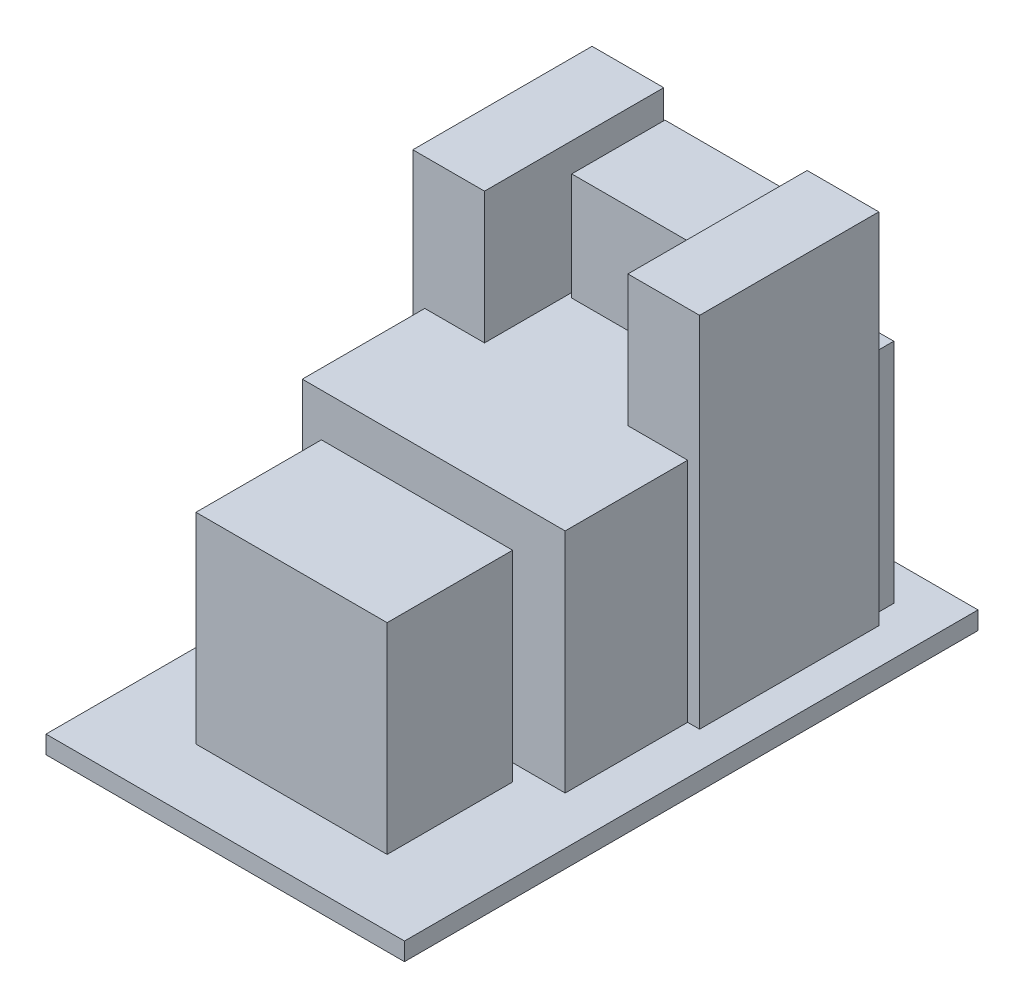
ISO-10303-21;
HEADER;
FILE_DESCRIPTION(('STEP AP214'),'2;1');
FILE_NAME('part.step','',(''),(''),'','','');
FILE_SCHEMA(('AUTOMOTIVE_DESIGN { 1 0 10303 214 1 1 1 1 }'));
ENDSEC;
DATA;
#1=APPLICATION_CONTEXT('core data for automotive mechanical design processes');
#2=APPLICATION_PROTOCOL_DEFINITION('international standard','automotive_design',2000,#1);
#3=PRODUCT_CONTEXT('',#1,'mechanical');
#4=PRODUCT('Part','Part','',(#3));
#5=PRODUCT_RELATED_PRODUCT_CATEGORY('part','',(#4));
#6=PRODUCT_DEFINITION_FORMATION('','',#4);
#7=PRODUCT_DEFINITION_CONTEXT('part definition',#1,'design');
#8=PRODUCT_DEFINITION('design','',#6,#7);
#9=PRODUCT_DEFINITION_SHAPE('','',#8);
#10=(LENGTH_UNIT() NAMED_UNIT(*) SI_UNIT(.MILLI.,.METRE.));
#11=(NAMED_UNIT(*) PLANE_ANGLE_UNIT() SI_UNIT($,.RADIAN.));
#12=(NAMED_UNIT(*) SI_UNIT($,.STERADIAN.) SOLID_ANGLE_UNIT());
#13=UNCERTAINTY_MEASURE_WITH_UNIT(LENGTH_MEASURE(1.E-05),#10,'distance_accuracy_value','');
#14=(GEOMETRIC_REPRESENTATION_CONTEXT(3) GLOBAL_UNCERTAINTY_ASSIGNED_CONTEXT((#13)) GLOBAL_UNIT_ASSIGNED_CONTEXT((#10,
#11,#12)) REPRESENTATION_CONTEXT('',''));
#15=CARTESIAN_POINT('',(0.,0.,0.));
#16=DIRECTION('',(0.,0.,1.));
#17=DIRECTION('',(1.,0.,0.));
#18=AXIS2_PLACEMENT_3D('',#15,#16,#17);
#19=CARTESIAN_POINT('',(0.,190.,0.));
#20=DIRECTION('',(0.,-1.,0.));
#21=DIRECTION('',(0.,0.,-1.));
#22=AXIS2_PLACEMENT_3D('',#19,#20,#21);
#23=PLANE('',#22);
#24=DIRECTION('',(-1.,0.,0.));
#25=VECTOR('',#24,1.);
#26=CARTESIAN_POINT('',(0.,190.,-187.));
#27=LINE('',#26,#25);
#28=CARTESIAN_POINT('',(110.,190.,-187.));
#29=VERTEX_POINT('',#28);
#30=CARTESIAN_POINT('',(60.,190.,-187.));
#31=VERTEX_POINT('',#30);
#32=EDGE_CURVE('E281',#29,#31,#27,.T.);
#33=ORIENTED_EDGE('',*,*,#32,.F.);
#34=DIRECTION('',(0.,0.,-1.));
#35=VECTOR('',#34,1.);
#36=CARTESIAN_POINT('',(110.,190.,65.5));
#37=LINE('',#36,#35);
#38=CARTESIAN_POINT('',(110.,190.,-209.5));
#39=VERTEX_POINT('',#38);
#40=EDGE_CURVE('E358',#29,#39,#37,.T.);
#41=ORIENTED_EDGE('',*,*,#40,.T.);
#42=DIRECTION('',(-1.,0.,0.));
#43=VECTOR('',#42,1.);
#44=CARTESIAN_POINT('',(-110.,190.,-209.5));
#45=LINE('',#44,#43);
#46=CARTESIAN_POINT('',(-110.,190.,-209.5));
#47=VERTEX_POINT('',#46);
#48=EDGE_CURVE('E357',#39,#47,#45,.T.);
#49=ORIENTED_EDGE('',*,*,#48,.T.);
#50=DIRECTION('',(0.,0.,1.));
#51=VECTOR('',#50,1.);
#52=CARTESIAN_POINT('',(-110.,190.,65.5));
#53=LINE('',#52,#51);
#54=CARTESIAN_POINT('',(-110.,190.,-187.));
#55=VERTEX_POINT('',#54);
#56=EDGE_CURVE('E361',#47,#55,#53,.T.);
#57=ORIENTED_EDGE('',*,*,#56,.T.);
#58=DIRECTION('',(-1.,0.,0.));
#59=VECTOR('',#58,1.);
#60=CARTESIAN_POINT('',(0.,190.,-187.));
#61=LINE('',#60,#59);
#62=CARTESIAN_POINT('',(-60.,190.,-187.));
#63=VERTEX_POINT('',#62);
#64=EDGE_CURVE('E428',#63,#55,#61,.T.);
#65=ORIENTED_EDGE('',*,*,#64,.F.);
#66=DIRECTION('',(0.,0.,-1.));
#67=VECTOR('',#66,1.);
#68=CARTESIAN_POINT('',(-60.,190.,0.));
#69=LINE('',#68,#67);
#70=CARTESIAN_POINT('',(-60.,190.,-37.));
#71=VERTEX_POINT('',#70);
#72=EDGE_CURVE('E425',#71,#63,#69,.T.);
#73=ORIENTED_EDGE('',*,*,#72,.F.);
#74=DIRECTION('',(1.,0.,0.));
#75=VECTOR('',#74,1.);
#76=CARTESIAN_POINT('',(0.,190.,-37.));
#77=LINE('',#76,#75);
#78=CARTESIAN_POINT('',(-110.,190.,-37.));
#79=VERTEX_POINT('',#78);
#80=EDGE_CURVE('E417',#79,#71,#77,.T.);
#81=ORIENTED_EDGE('',*,*,#80,.F.);
#82=CARTESIAN_POINT('',(-110.,190.,65.5));
#83=VERTEX_POINT('',#82);
#84=EDGE_CURVE('E360',#79,#83,#53,.T.);
#85=ORIENTED_EDGE('',*,*,#84,.T.);
#86=DIRECTION('',(1.,0.,0.));
#87=VECTOR('',#86,1.);
#88=CARTESIAN_POINT('',(-110.,190.,65.5));
#89=LINE('',#88,#87);
#90=CARTESIAN_POINT('',(110.,190.,65.5));
#91=VERTEX_POINT('',#90);
#92=EDGE_CURVE('E364',#83,#91,#89,.T.);
#93=ORIENTED_EDGE('',*,*,#92,.T.);
#94=CARTESIAN_POINT('',(110.,190.,-37.));
#95=VERTEX_POINT('',#94);
#96=EDGE_CURVE('E354',#91,#95,#37,.T.);
#97=ORIENTED_EDGE('',*,*,#96,.T.);
#98=DIRECTION('',(1.,0.,0.));
#99=VECTOR('',#98,1.);
#100=CARTESIAN_POINT('',(0.,190.,-37.));
#101=LINE('',#100,#99);
#102=CARTESIAN_POINT('',(60.,190.,-37.));
#103=VERTEX_POINT('',#102);
#104=EDGE_CURVE('E278',#103,#95,#101,.T.);
#105=ORIENTED_EDGE('',*,*,#104,.F.);
#106=DIRECTION('',(0.,0.,1.));
#107=VECTOR('',#106,1.);
#108=CARTESIAN_POINT('',(60.,190.,0.));
#109=LINE('',#108,#107);
#110=EDGE_CURVE('E437',#31,#103,#109,.T.);
#111=ORIENTED_EDGE('',*,*,#110,.F.);
#112=EDGE_LOOP('',(#33,#41,#49,#57,#65,#73,#81,#85,#93,#97,#105,#111));
#113=FACE_BOUND('',#112,.T.);
#114=DIRECTION('',(0.,0.,-1.));
#115=VECTOR('',#114,1.);
#116=CARTESIAN_POINT('',(56.,190.,0.));
#117=LINE('',#116,#115);
#118=CARTESIAN_POINT('',(56.,190.,-106.));
#119=VERTEX_POINT('',#118);
#120=CARTESIAN_POINT('',(56.,190.,-184.));
#121=VERTEX_POINT('',#120);
#122=EDGE_CURVE('E11',#119,#121,#117,.T.);
#123=ORIENTED_EDGE('',*,*,#122,.F.);
#124=DIRECTION('',(1.,0.,0.));
#125=VECTOR('',#124,1.);
#126=CARTESIAN_POINT('',(0.,190.,-106.));
#127=LINE('',#126,#125);
#128=CARTESIAN_POINT('',(-56.,190.,-106.));
#129=VERTEX_POINT('',#128);
#130=EDGE_CURVE('E440',#129,#119,#127,.T.);
#131=ORIENTED_EDGE('',*,*,#130,.F.);
#132=DIRECTION('',(0.,0.,1.));
#133=VECTOR('',#132,1.);
#134=CARTESIAN_POINT('',(-56.,190.,0.));
#135=LINE('',#134,#133);
#136=CARTESIAN_POINT('',(-56.,190.,-184.));
#137=VERTEX_POINT('',#136);
#138=EDGE_CURVE('E59',#137,#129,#135,.T.);
#139=ORIENTED_EDGE('',*,*,#138,.F.);
#140=DIRECTION('',(-1.,0.,0.));
#141=VECTOR('',#140,1.);
#142=CARTESIAN_POINT('',(0.,190.,-184.));
#143=LINE('',#142,#141);
#144=EDGE_CURVE('E49',#121,#137,#143,.T.);
#145=ORIENTED_EDGE('',*,*,#144,.F.);
#146=EDGE_LOOP('',(#123,#131,#139,#145));
#147=FACE_BOUND('',#146,.T.);
#148=ADVANCED_FACE('F41',(#113,#147),#23,.F.);
#149=CARTESIAN_POINT('',(0.,0.,0.));
#150=DIRECTION('',(0.,-1.,0.));
#151=DIRECTION('',(0.,0.,-1.));
#152=AXIS2_PLACEMENT_3D('',#149,#150,#151);
#153=PLANE('',#152);
#154=DIRECTION('',(0.,0.,-1.));
#155=VECTOR('',#154,1.);
#156=CARTESIAN_POINT('',(150.,0.,240.));
#157=LINE('',#156,#155);
#158=CARTESIAN_POINT('',(150.,0.,240.));
#159=VERTEX_POINT('',#158);
#160=CARTESIAN_POINT('',(150.,0.,-240.));
#161=VERTEX_POINT('',#160);
#162=EDGE_CURVE('E390',#159,#161,#157,.T.);
#163=ORIENTED_EDGE('',*,*,#162,.T.);
#164=DIRECTION('',(-1.,0.,0.));
#165=VECTOR('',#164,1.);
#166=CARTESIAN_POINT('',(-150.,0.,-240.));
#167=LINE('',#166,#165);
#168=CARTESIAN_POINT('',(-150.,0.,-240.));
#169=VERTEX_POINT('',#168);
#170=EDGE_CURVE('E407',#161,#169,#167,.T.);
#171=ORIENTED_EDGE('',*,*,#170,.T.);
#172=DIRECTION('',(0.,0.,1.));
#173=VECTOR('',#172,1.);
#174=CARTESIAN_POINT('',(-150.,0.,240.));
#175=LINE('',#174,#173);
#176=CARTESIAN_POINT('',(-150.,0.,240.));
#177=VERTEX_POINT('',#176);
#178=EDGE_CURVE('E410',#169,#177,#175,.T.);
#179=ORIENTED_EDGE('',*,*,#178,.T.);
#180=DIRECTION('',(1.,0.,0.));
#181=VECTOR('',#180,1.);
#182=CARTESIAN_POINT('',(-150.,0.,240.));
#183=LINE('',#182,#181);
#184=EDGE_CURVE('E395',#177,#159,#183,.T.);
#185=ORIENTED_EDGE('',*,*,#184,.T.);
#186=EDGE_LOOP('',(#163,#171,#179,#185));
#187=FACE_BOUND('',#186,.T.);
#188=DIRECTION('',(0.,0.,-1.));
#189=VECTOR('',#188,1.);
#190=CARTESIAN_POINT('',(80.,0.,184.5));
#191=LINE('',#190,#189);
#192=CARTESIAN_POINT('',(80.,0.,184.5));
#193=VERTEX_POINT('',#192);
#194=CARTESIAN_POINT('',(80.,0.,79.5));
#195=VERTEX_POINT('',#194);
#196=EDGE_CURVE('E320',#193,#195,#191,.T.);
#197=ORIENTED_EDGE('',*,*,#196,.F.);
#198=DIRECTION('',(1.,0.,0.));
#199=VECTOR('',#198,1.);
#200=CARTESIAN_POINT('',(-80.,0.,184.5));
#201=LINE('',#200,#199);
#202=CARTESIAN_POINT('',(-80.,0.,184.5));
#203=VERTEX_POINT('',#202);
#204=EDGE_CURVE('E325',#203,#193,#201,.T.);
#205=ORIENTED_EDGE('',*,*,#204,.F.);
#206=DIRECTION('',(0.,0.,1.));
#207=VECTOR('',#206,1.);
#208=CARTESIAN_POINT('',(-80.,0.,184.5));
#209=LINE('',#208,#207);
#210=CARTESIAN_POINT('',(-80.,0.,79.5));
#211=VERTEX_POINT('',#210);
#212=EDGE_CURVE('E337',#211,#203,#209,.T.);
#213=ORIENTED_EDGE('',*,*,#212,.F.);
#214=DIRECTION('',(-1.,0.,0.));
#215=VECTOR('',#214,1.);
#216=CARTESIAN_POINT('',(-80.,0.,79.5));
#217=LINE('',#216,#215);
#218=EDGE_CURVE('E334',#195,#211,#217,.T.);
#219=ORIENTED_EDGE('',*,*,#218,.F.);
#220=EDGE_LOOP('',(#197,#205,#213,#219));
#221=FACE_BOUND('',#220,.T.);
#222=DIRECTION('',(-1.,0.,0.));
#223=VECTOR('',#222,1.);
#224=CARTESIAN_POINT('',(60.,0.,-187.));
#225=LINE('',#224,#223);
#226=CARTESIAN_POINT('',(120.,0.,-187.));
#227=VERTEX_POINT('',#226);
#228=CARTESIAN_POINT('',(110.,0.,-187.));
#229=VERTEX_POINT('',#228);
#230=EDGE_CURVE('E246',#227,#229,#225,.T.);
#231=ORIENTED_EDGE('',*,*,#230,.F.);
#232=DIRECTION('',(0.,0.,-1.));
#233=VECTOR('',#232,1.);
#234=CARTESIAN_POINT('',(120.,0.,-37.));
#235=LINE('',#234,#233);
#236=CARTESIAN_POINT('',(120.,0.,-37.));
#237=VERTEX_POINT('',#236);
#238=EDGE_CURVE('E243',#237,#227,#235,.T.);
#239=ORIENTED_EDGE('',*,*,#238,.F.);
#240=DIRECTION('',(1.,0.,0.));
#241=VECTOR('',#240,1.);
#242=CARTESIAN_POINT('',(60.,0.,-37.));
#243=LINE('',#242,#241);
#244=CARTESIAN_POINT('',(110.,0.,-37.));
#245=VERTEX_POINT('',#244);
#246=EDGE_CURVE('E256',#245,#237,#243,.T.);
#247=ORIENTED_EDGE('',*,*,#246,.F.);
#248=DIRECTION('',(0.,0.,-1.));
#249=VECTOR('',#248,1.);
#250=CARTESIAN_POINT('',(110.,0.,65.5));
#251=LINE('',#250,#249);
#252=CARTESIAN_POINT('',(110.,0.,65.5));
#253=VERTEX_POINT('',#252);
#254=EDGE_CURVE('E367',#253,#245,#251,.T.);
#255=ORIENTED_EDGE('',*,*,#254,.F.);
#256=DIRECTION('',(1.,0.,0.));
#257=VECTOR('',#256,1.);
#258=CARTESIAN_POINT('',(-110.,0.,65.5));
#259=LINE('',#258,#257);
#260=CARTESIAN_POINT('',(-110.,0.,65.5));
#261=VERTEX_POINT('',#260);
#262=EDGE_CURVE('E376',#261,#253,#259,.T.);
#263=ORIENTED_EDGE('',*,*,#262,.F.);
#264=DIRECTION('',(0.,0.,1.));
#265=VECTOR('',#264,1.);
#266=CARTESIAN_POINT('',(-110.,0.,65.5));
#267=LINE('',#266,#265);
#268=CARTESIAN_POINT('',(-110.,0.,-37.));
#269=VERTEX_POINT('',#268);
#270=EDGE_CURVE('E372',#269,#261,#267,.T.);
#271=ORIENTED_EDGE('',*,*,#270,.F.);
#272=DIRECTION('',(1.,0.,0.));
#273=VECTOR('',#272,1.);
#274=CARTESIAN_POINT('',(-120.,0.,-37.));
#275=LINE('',#274,#273);
#276=CARTESIAN_POINT('',(-120.,0.,-37.));
#277=VERTEX_POINT('',#276);
#278=EDGE_CURVE('E289',#277,#269,#275,.T.);
#279=ORIENTED_EDGE('',*,*,#278,.F.);
#280=DIRECTION('',(0.,0.,1.));
#281=VECTOR('',#280,1.);
#282=CARTESIAN_POINT('',(-120.,0.,-37.));
#283=LINE('',#282,#281);
#284=CARTESIAN_POINT('',(-120.,0.,-187.));
#285=VERTEX_POINT('',#284);
#286=EDGE_CURVE('E298',#285,#277,#283,.T.);
#287=ORIENTED_EDGE('',*,*,#286,.F.);
#288=DIRECTION('',(-1.,0.,0.));
#289=VECTOR('',#288,1.);
#290=CARTESIAN_POINT('',(-120.,0.,-187.));
#291=LINE('',#290,#289);
#292=CARTESIAN_POINT('',(-110.,0.,-187.));
#293=VERTEX_POINT('',#292);
#294=EDGE_CURVE('E284',#293,#285,#291,.T.);
#295=ORIENTED_EDGE('',*,*,#294,.F.);
#296=CARTESIAN_POINT('',(-110.,0.,-209.5));
#297=VERTEX_POINT('',#296);
#298=EDGE_CURVE('E373',#297,#293,#267,.T.);
#299=ORIENTED_EDGE('',*,*,#298,.F.);
#300=DIRECTION('',(-1.,0.,0.));
#301=VECTOR('',#300,1.);
#302=CARTESIAN_POINT('',(-110.,0.,-209.5));
#303=LINE('',#302,#301);
#304=CARTESIAN_POINT('',(110.,0.,-209.5));
#305=VERTEX_POINT('',#304);
#306=EDGE_CURVE('E369',#305,#297,#303,.T.);
#307=ORIENTED_EDGE('',*,*,#306,.F.);
#308=EDGE_CURVE('E353',#229,#305,#251,.T.);
#309=ORIENTED_EDGE('',*,*,#308,.F.);
#310=EDGE_LOOP('',(#231,#239,#247,#255,#263,#271,#279,#287,#295,#299,#307,#309));
#311=FACE_BOUND('',#310,.T.);
#312=ADVANCED_FACE('F454',(#187,#221,#311),#153,.F.);
#313=CARTESIAN_POINT('',(110.,190.,65.5));
#314=DIRECTION('',(-1.,0.,0.));
#315=DIRECTION('',(0.,0.,1.));
#316=AXIS2_PLACEMENT_3D('',#313,#314,#315);
#317=PLANE('',#316);
#318=DIRECTION('',(0.,1.,0.));
#319=VECTOR('',#318,1.);
#320=CARTESIAN_POINT('',(110.,190.,-187.));
#321=LINE('',#320,#319);
#322=EDGE_CURVE('E434',#229,#29,#321,.T.);
#323=ORIENTED_EDGE('',*,*,#322,.F.);
#324=ORIENTED_EDGE('',*,*,#308,.T.);
#325=DIRECTION('',(0.,-1.,0.));
#326=VECTOR('',#325,1.);
#327=CARTESIAN_POINT('',(110.,190.,-209.5));
#328=LINE('',#327,#326);
#329=EDGE_CURVE('E387',#39,#305,#328,.T.);
#330=ORIENTED_EDGE('',*,*,#329,.F.);
#331=ORIENTED_EDGE('',*,*,#40,.F.);
#332=EDGE_LOOP('',(#323,#324,#330,#331));
#333=FACE_BOUND('',#332,.T.);
#334=ADVANCED_FACE('F462',(#333),#317,.F.);
#335=DIRECTION('',(0.,-1.,0.));
#336=VECTOR('',#335,1.);
#337=CARTESIAN_POINT('',(110.,190.,-37.));
#338=LINE('',#337,#336);
#339=EDGE_CURVE('E431',#95,#245,#338,.T.);
#340=ORIENTED_EDGE('',*,*,#339,.F.);
#341=ORIENTED_EDGE('',*,*,#96,.F.);
#342=DIRECTION('',(0.,-1.,0.));
#343=VECTOR('',#342,1.);
#344=CARTESIAN_POINT('',(110.,190.,65.5));
#345=LINE('',#344,#343);
#346=EDGE_CURVE('E366',#91,#253,#345,.T.);
#347=ORIENTED_EDGE('',*,*,#346,.T.);
#348=ORIENTED_EDGE('',*,*,#254,.T.);
#349=EDGE_LOOP('',(#340,#341,#347,#348));
#350=FACE_BOUND('',#349,.T.);
#351=ADVANCED_FACE('F478',(#350),#317,.F.);
#352=CARTESIAN_POINT('',(-110.,190.,65.5));
#353=DIRECTION('',(1.,0.,0.));
#354=DIRECTION('',(0.,0.,-1.));
#355=AXIS2_PLACEMENT_3D('',#352,#353,#354);
#356=PLANE('',#355);
#357=DIRECTION('',(0.,-1.,0.));
#358=VECTOR('',#357,1.);
#359=CARTESIAN_POINT('',(-110.,190.,-187.));
#360=LINE('',#359,#358);
#361=EDGE_CURVE('E317',#55,#293,#360,.T.);
#362=ORIENTED_EDGE('',*,*,#361,.F.);
#363=ORIENTED_EDGE('',*,*,#56,.F.);
#364=DIRECTION('',(0.,-1.,0.));
#365=VECTOR('',#364,1.);
#366=CARTESIAN_POINT('',(-110.,190.,-209.5));
#367=LINE('',#366,#365);
#368=EDGE_CURVE('E384',#47,#297,#367,.T.);
#369=ORIENTED_EDGE('',*,*,#368,.T.);
#370=ORIENTED_EDGE('',*,*,#298,.T.);
#371=EDGE_LOOP('',(#362,#363,#369,#370));
#372=FACE_BOUND('',#371,.T.);
#373=ADVANCED_FACE('F474',(#372),#356,.F.);
#374=DIRECTION('',(0.,1.,0.));
#375=VECTOR('',#374,1.);
#376=CARTESIAN_POINT('',(-110.,190.,-37.));
#377=LINE('',#376,#375);
#378=EDGE_CURVE('E314',#269,#79,#377,.T.);
#379=ORIENTED_EDGE('',*,*,#378,.F.);
#380=ORIENTED_EDGE('',*,*,#270,.T.);
#381=DIRECTION('',(0.,-1.,0.));
#382=VECTOR('',#381,1.);
#383=CARTESIAN_POINT('',(-110.,190.,65.5));
#384=LINE('',#383,#382);
#385=EDGE_CURVE('E381',#83,#261,#384,.T.);
#386=ORIENTED_EDGE('',*,*,#385,.F.);
#387=ORIENTED_EDGE('',*,*,#84,.F.);
#388=EDGE_LOOP('',(#379,#380,#386,#387));
#389=FACE_BOUND('',#388,.T.);
#390=ADVANCED_FACE('F477',(#389),#356,.F.);
#391=CARTESIAN_POINT('',(150.,-15.,240.));
#392=DIRECTION('',(1.,0.,0.));
#393=DIRECTION('',(0.,0.,-1.));
#394=AXIS2_PLACEMENT_3D('',#391,#392,#393);
#395=PLANE('',#394);
#396=ORIENTED_EDGE('',*,*,#162,.F.);
#397=DIRECTION('',(0.,1.,0.));
#398=VECTOR('',#397,1.);
#399=CARTESIAN_POINT('',(150.,-15.,240.));
#400=LINE('',#399,#398);
#401=CARTESIAN_POINT('',(150.,-15.,240.));
#402=VERTEX_POINT('',#401);
#403=EDGE_CURVE('E415',#402,#159,#400,.T.);
#404=ORIENTED_EDGE('',*,*,#403,.F.);
#405=DIRECTION('',(0.,0.,-1.));
#406=VECTOR('',#405,1.);
#407=CARTESIAN_POINT('',(150.,-15.,240.));
#408=LINE('',#407,#406);
#409=CARTESIAN_POINT('',(150.,-15.,-240.));
#410=VERTEX_POINT('',#409);
#411=EDGE_CURVE('E391',#402,#410,#408,.T.);
#412=ORIENTED_EDGE('',*,*,#411,.T.);
#413=DIRECTION('',(0.,1.,0.));
#414=VECTOR('',#413,1.);
#415=CARTESIAN_POINT('',(150.,-15.,-240.));
#416=LINE('',#415,#414);
#417=EDGE_CURVE('E404',#410,#161,#416,.T.);
#418=ORIENTED_EDGE('',*,*,#417,.T.);
#419=EDGE_LOOP('',(#396,#404,#412,#418));
#420=FACE_BOUND('',#419,.T.);
#421=ADVANCED_FACE('F43',(#420),#395,.T.);
#422=CARTESIAN_POINT('',(-150.,-15.,240.));
#423=DIRECTION('',(0.,0.,1.));
#424=DIRECTION('',(1.,0.,0.));
#425=AXIS2_PLACEMENT_3D('',#422,#423,#424);
#426=PLANE('',#425);
#427=ORIENTED_EDGE('',*,*,#184,.F.);
#428=DIRECTION('',(0.,1.,0.));
#429=VECTOR('',#428,1.);
#430=CARTESIAN_POINT('',(-150.,-15.,240.));
#431=LINE('',#430,#429);
#432=CARTESIAN_POINT('',(-150.,-15.,240.));
#433=VERTEX_POINT('',#432);
#434=EDGE_CURVE('E418',#433,#177,#431,.T.);
#435=ORIENTED_EDGE('',*,*,#434,.F.);
#436=DIRECTION('',(1.,0.,0.));
#437=VECTOR('',#436,1.);
#438=CARTESIAN_POINT('',(-150.,-15.,240.));
#439=LINE('',#438,#437);
#440=EDGE_CURVE('E401',#433,#402,#439,.T.);
#441=ORIENTED_EDGE('',*,*,#440,.T.);
#442=ORIENTED_EDGE('',*,*,#403,.T.);
#443=EDGE_LOOP('',(#427,#435,#441,#442));
#444=FACE_BOUND('',#443,.T.);
#445=ADVANCED_FACE('F491',(#444),#426,.T.);
#446=CARTESIAN_POINT('',(-150.,-15.,240.));
#447=DIRECTION('',(-1.,0.,0.));
#448=DIRECTION('',(0.,0.,1.));
#449=AXIS2_PLACEMENT_3D('',#446,#447,#448);
#450=PLANE('',#449);
#451=ORIENTED_EDGE('',*,*,#178,.F.);
#452=DIRECTION('',(0.,1.,0.));
#453=VECTOR('',#452,1.);
#454=CARTESIAN_POINT('',(-150.,-15.,-240.));
#455=LINE('',#454,#453);
#456=CARTESIAN_POINT('',(-150.,-15.,-240.));
#457=VERTEX_POINT('',#456);
#458=EDGE_CURVE('E420',#457,#169,#455,.T.);
#459=ORIENTED_EDGE('',*,*,#458,.F.);
#460=DIRECTION('',(0.,0.,1.));
#461=VECTOR('',#460,1.);
#462=CARTESIAN_POINT('',(-150.,-15.,240.));
#463=LINE('',#462,#461);
#464=EDGE_CURVE('E398',#457,#433,#463,.T.);
#465=ORIENTED_EDGE('',*,*,#464,.T.);
#466=ORIENTED_EDGE('',*,*,#434,.T.);
#467=EDGE_LOOP('',(#451,#459,#465,#466));
#468=FACE_BOUND('',#467,.T.);
#469=ADVANCED_FACE('F494',(#468),#450,.T.);
#470=CARTESIAN_POINT('',(-150.,-15.,-240.));
#471=DIRECTION('',(0.,0.,-1.));
#472=DIRECTION('',(-1.,0.,0.));
#473=AXIS2_PLACEMENT_3D('',#470,#471,#472);
#474=PLANE('',#473);
#475=ORIENTED_EDGE('',*,*,#170,.F.);
#476=ORIENTED_EDGE('',*,*,#417,.F.);
#477=DIRECTION('',(-1.,0.,0.));
#478=VECTOR('',#477,1.);
#479=CARTESIAN_POINT('',(-150.,-15.,-240.));
#480=LINE('',#479,#478);
#481=EDGE_CURVE('E394',#410,#457,#480,.T.);
#482=ORIENTED_EDGE('',*,*,#481,.T.);
#483=ORIENTED_EDGE('',*,*,#458,.T.);
#484=EDGE_LOOP('',(#475,#476,#482,#483));
#485=FACE_BOUND('',#484,.T.);
#486=ADVANCED_FACE('F488',(#485),#474,.T.);
#487=CARTESIAN_POINT('',(0.,-15.,0.));
#488=DIRECTION('',(0.,-1.,0.));
#489=DIRECTION('',(0.,0.,-1.));
#490=AXIS2_PLACEMENT_3D('',#487,#488,#489);
#491=PLANE('',#490);
#492=ORIENTED_EDGE('',*,*,#411,.F.);
#493=ORIENTED_EDGE('',*,*,#440,.F.);
#494=ORIENTED_EDGE('',*,*,#464,.F.);
#495=ORIENTED_EDGE('',*,*,#481,.F.);
#496=EDGE_LOOP('',(#492,#493,#494,#495));
#497=FACE_BOUND('',#496,.T.);
#498=ADVANCED_FACE('F482',(#497),#491,.T.);
#499=CARTESIAN_POINT('',(-110.,190.,-209.5));
#500=DIRECTION('',(0.,0.,1.));
#501=DIRECTION('',(1.,0.,0.));
#502=AXIS2_PLACEMENT_3D('',#499,#500,#501);
#503=PLANE('',#502);
#504=ORIENTED_EDGE('',*,*,#306,.T.);
#505=ORIENTED_EDGE('',*,*,#368,.F.);
#506=ORIENTED_EDGE('',*,*,#48,.F.);
#507=ORIENTED_EDGE('',*,*,#329,.T.);
#508=EDGE_LOOP('',(#504,#505,#506,#507));
#509=FACE_BOUND('',#508,.T.);
#510=ADVANCED_FACE('F472',(#509),#503,.F.);
#511=CARTESIAN_POINT('',(-110.,190.,65.5));
#512=DIRECTION('',(0.,0.,-1.));
#513=DIRECTION('',(-1.,0.,0.));
#514=AXIS2_PLACEMENT_3D('',#511,#512,#513);
#515=PLANE('',#514);
#516=ORIENTED_EDGE('',*,*,#262,.T.);
#517=ORIENTED_EDGE('',*,*,#346,.F.);
#518=ORIENTED_EDGE('',*,*,#92,.F.);
#519=ORIENTED_EDGE('',*,*,#385,.T.);
#520=EDGE_LOOP('',(#516,#517,#518,#519));
#521=FACE_BOUND('',#520,.T.);
#522=ADVANCED_FACE('F469',(#521),#515,.F.);
#523=CARTESIAN_POINT('',(80.,168.,184.5));
#524=DIRECTION('',(-1.,0.,0.));
#525=DIRECTION('',(0.,0.,1.));
#526=AXIS2_PLACEMENT_3D('',#523,#524,#525);
#527=PLANE('',#526);
#528=ORIENTED_EDGE('',*,*,#196,.T.);
#529=DIRECTION('',(0.,-1.,0.));
#530=VECTOR('',#529,1.);
#531=CARTESIAN_POINT('',(80.,168.,79.5));
#532=LINE('',#531,#530);
#533=CARTESIAN_POINT('',(80.,168.,79.5));
#534=VERTEX_POINT('',#533);
#535=EDGE_CURVE('E350',#534,#195,#532,.T.);
#536=ORIENTED_EDGE('',*,*,#535,.F.);
#537=DIRECTION('',(0.,0.,-1.));
#538=VECTOR('',#537,1.);
#539=CARTESIAN_POINT('',(80.,168.,184.5));
#540=LINE('',#539,#538);
#541=CARTESIAN_POINT('',(80.,168.,184.5));
#542=VERTEX_POINT('',#541);
#543=EDGE_CURVE('E321',#542,#534,#540,.T.);
#544=ORIENTED_EDGE('',*,*,#543,.F.);
#545=DIRECTION('',(0.,-1.,0.));
#546=VECTOR('',#545,1.);
#547=CARTESIAN_POINT('',(80.,168.,184.5));
#548=LINE('',#547,#546);
#549=EDGE_CURVE('E331',#542,#193,#548,.T.);
#550=ORIENTED_EDGE('',*,*,#549,.T.);
#551=EDGE_LOOP('',(#528,#536,#544,#550));
#552=FACE_BOUND('',#551,.T.);
#553=ADVANCED_FACE('F467',(#552),#527,.F.);
#554=CARTESIAN_POINT('',(-80.,168.,79.5));
#555=DIRECTION('',(0.,0.,1.));
#556=DIRECTION('',(1.,0.,0.));
#557=AXIS2_PLACEMENT_3D('',#554,#555,#556);
#558=PLANE('',#557);
#559=ORIENTED_EDGE('',*,*,#218,.T.);
#560=DIRECTION('',(0.,-1.,0.));
#561=VECTOR('',#560,1.);
#562=CARTESIAN_POINT('',(-80.,168.,79.5));
#563=LINE('',#562,#561);
#564=CARTESIAN_POINT('',(-80.,168.,79.5));
#565=VERTEX_POINT('',#564);
#566=EDGE_CURVE('E347',#565,#211,#563,.T.);
#567=ORIENTED_EDGE('',*,*,#566,.F.);
#568=DIRECTION('',(-1.,0.,0.));
#569=VECTOR('',#568,1.);
#570=CARTESIAN_POINT('',(-80.,168.,79.5));
#571=LINE('',#570,#569);
#572=EDGE_CURVE('E324',#534,#565,#571,.T.);
#573=ORIENTED_EDGE('',*,*,#572,.F.);
#574=ORIENTED_EDGE('',*,*,#535,.T.);
#575=EDGE_LOOP('',(#559,#567,#573,#574));
#576=FACE_BOUND('',#575,.T.);
#577=ADVANCED_FACE('F593',(#576),#558,.F.);
#578=CARTESIAN_POINT('',(-80.,168.,184.5));
#579=DIRECTION('',(1.,0.,0.));
#580=DIRECTION('',(0.,0.,-1.));
#581=AXIS2_PLACEMENT_3D('',#578,#579,#580);
#582=PLANE('',#581);
#583=ORIENTED_EDGE('',*,*,#212,.T.);
#584=DIRECTION('',(0.,-1.,0.));
#585=VECTOR('',#584,1.);
#586=CARTESIAN_POINT('',(-80.,168.,184.5));
#587=LINE('',#586,#585);
#588=CARTESIAN_POINT('',(-80.,168.,184.5));
#589=VERTEX_POINT('',#588);
#590=EDGE_CURVE('E344',#589,#203,#587,.T.);
#591=ORIENTED_EDGE('',*,*,#590,.F.);
#592=DIRECTION('',(0.,0.,1.));
#593=VECTOR('',#592,1.);
#594=CARTESIAN_POINT('',(-80.,168.,184.5));
#595=LINE('',#594,#593);
#596=EDGE_CURVE('E327',#565,#589,#595,.T.);
#597=ORIENTED_EDGE('',*,*,#596,.F.);
#598=ORIENTED_EDGE('',*,*,#566,.T.);
#599=EDGE_LOOP('',(#583,#591,#597,#598));
#600=FACE_BOUND('',#599,.T.);
#601=ADVANCED_FACE('F590',(#600),#582,.F.);
#602=CARTESIAN_POINT('',(-80.,168.,184.5));
#603=DIRECTION('',(0.,0.,-1.));
#604=DIRECTION('',(-1.,0.,0.));
#605=AXIS2_PLACEMENT_3D('',#602,#603,#604);
#606=PLANE('',#605);
#607=ORIENTED_EDGE('',*,*,#204,.T.);
#608=ORIENTED_EDGE('',*,*,#549,.F.);
#609=DIRECTION('',(1.,0.,0.));
#610=VECTOR('',#609,1.);
#611=CARTESIAN_POINT('',(-80.,168.,184.5));
#612=LINE('',#611,#610);
#613=EDGE_CURVE('E329',#589,#542,#612,.T.);
#614=ORIENTED_EDGE('',*,*,#613,.F.);
#615=ORIENTED_EDGE('',*,*,#590,.T.);
#616=EDGE_LOOP('',(#607,#608,#614,#615));
#617=FACE_BOUND('',#616,.T.);
#618=ADVANCED_FACE('F586',(#617),#606,.F.);
#619=CARTESIAN_POINT('',(0.,168.,0.));
#620=DIRECTION('',(0.,-1.,0.));
#621=DIRECTION('',(0.,0.,-1.));
#622=AXIS2_PLACEMENT_3D('',#619,#620,#621);
#623=PLANE('',#622);
#624=ORIENTED_EDGE('',*,*,#543,.T.);
#625=ORIENTED_EDGE('',*,*,#572,.T.);
#626=ORIENTED_EDGE('',*,*,#596,.T.);
#627=ORIENTED_EDGE('',*,*,#613,.T.);
#628=EDGE_LOOP('',(#624,#625,#626,#627));
#629=FACE_BOUND('',#628,.T.);
#630=ADVANCED_FACE('F583',(#629),#623,.F.);
#631=CARTESIAN_POINT('',(-60.,300.,-37.));
#632=DIRECTION('',(-1.,0.,0.));
#633=DIRECTION('',(0.,0.,1.));
#634=AXIS2_PLACEMENT_3D('',#631,#632,#633);
#635=PLANE('',#634);
#636=DIRECTION('',(0.,-1.,0.));
#637=VECTOR('',#636,1.);
#638=CARTESIAN_POINT('',(-60.,300.,-37.));
#639=LINE('',#638,#637);
#640=CARTESIAN_POINT('',(-60.,300.,-37.));
#641=VERTEX_POINT('',#640);
#642=EDGE_CURVE('E295',#641,#71,#639,.T.);
#643=ORIENTED_EDGE('',*,*,#642,.T.);
#644=ORIENTED_EDGE('',*,*,#72,.T.);
#645=DIRECTION('',(0.,-1.,0.));
#646=VECTOR('',#645,1.);
#647=CARTESIAN_POINT('',(-60.,300.,-187.));
#648=LINE('',#647,#646);
#649=CARTESIAN_POINT('',(-60.,300.,-187.));
#650=VERTEX_POINT('',#649);
#651=EDGE_CURVE('E311',#650,#63,#648,.T.);
#652=ORIENTED_EDGE('',*,*,#651,.F.);
#653=DIRECTION('',(0.,0.,-1.));
#654=VECTOR('',#653,1.);
#655=CARTESIAN_POINT('',(-60.,300.,-37.));
#656=LINE('',#655,#654);
#657=EDGE_CURVE('E285',#641,#650,#656,.T.);
#658=ORIENTED_EDGE('',*,*,#657,.F.);
#659=EDGE_LOOP('',(#643,#644,#652,#658));
#660=FACE_BOUND('',#659,.T.);
#661=ADVANCED_FACE('F561',(#660),#635,.F.);
#662=CARTESIAN_POINT('',(-120.,300.,-187.));
#663=DIRECTION('',(0.,0.,1.));
#664=DIRECTION('',(1.,0.,0.));
#665=AXIS2_PLACEMENT_3D('',#662,#663,#664);
#666=PLANE('',#665);
#667=ORIENTED_EDGE('',*,*,#64,.T.);
#668=ORIENTED_EDGE('',*,*,#361,.T.);
#669=ORIENTED_EDGE('',*,*,#294,.T.);
#670=DIRECTION('',(0.,-1.,0.));
#671=VECTOR('',#670,1.);
#672=CARTESIAN_POINT('',(-120.,300.,-187.));
#673=LINE('',#672,#671);
#674=CARTESIAN_POINT('',(-120.,300.,-187.));
#675=VERTEX_POINT('',#674);
#676=EDGE_CURVE('E308',#675,#285,#673,.T.);
#677=ORIENTED_EDGE('',*,*,#676,.F.);
#678=DIRECTION('',(-1.,0.,0.));
#679=VECTOR('',#678,1.);
#680=CARTESIAN_POINT('',(-120.,300.,-187.));
#681=LINE('',#680,#679);
#682=EDGE_CURVE('E288',#650,#675,#681,.T.);
#683=ORIENTED_EDGE('',*,*,#682,.F.);
#684=ORIENTED_EDGE('',*,*,#651,.T.);
#685=EDGE_LOOP('',(#667,#668,#669,#677,#683,#684));
#686=FACE_BOUND('',#685,.T.);
#687=ADVANCED_FACE('F535',(#686),#666,.F.);
#688=CARTESIAN_POINT('',(-120.,300.,-37.));
#689=DIRECTION('',(0.,0.,-1.));
#690=DIRECTION('',(-1.,0.,0.));
#691=AXIS2_PLACEMENT_3D('',#688,#689,#690);
#692=PLANE('',#691);
#693=ORIENTED_EDGE('',*,*,#278,.T.);
#694=ORIENTED_EDGE('',*,*,#378,.T.);
#695=ORIENTED_EDGE('',*,*,#80,.T.);
#696=ORIENTED_EDGE('',*,*,#642,.F.);
#697=DIRECTION('',(1.,0.,0.));
#698=VECTOR('',#697,1.);
#699=CARTESIAN_POINT('',(-120.,300.,-37.));
#700=LINE('',#699,#698);
#701=CARTESIAN_POINT('',(-120.,300.,-37.));
#702=VERTEX_POINT('',#701);
#703=EDGE_CURVE('E293',#702,#641,#700,.T.);
#704=ORIENTED_EDGE('',*,*,#703,.F.);
#705=DIRECTION('',(0.,-1.,0.));
#706=VECTOR('',#705,1.);
#707=CARTESIAN_POINT('',(-120.,300.,-37.));
#708=LINE('',#707,#706);
#709=EDGE_CURVE('E305',#702,#277,#708,.T.);
#710=ORIENTED_EDGE('',*,*,#709,.T.);
#711=EDGE_LOOP('',(#693,#694,#695,#696,#704,#710));
#712=FACE_BOUND('',#711,.T.);
#713=ADVANCED_FACE('F526',(#712),#692,.F.);
#714=CARTESIAN_POINT('',(-120.,300.,-37.));
#715=DIRECTION('',(1.,0.,0.));
#716=DIRECTION('',(0.,0.,-1.));
#717=AXIS2_PLACEMENT_3D('',#714,#715,#716);
#718=PLANE('',#717);
#719=ORIENTED_EDGE('',*,*,#286,.T.);
#720=ORIENTED_EDGE('',*,*,#709,.F.);
#721=DIRECTION('',(0.,0.,1.));
#722=VECTOR('',#721,1.);
#723=CARTESIAN_POINT('',(-120.,300.,-37.));
#724=LINE('',#723,#722);
#725=EDGE_CURVE('E291',#675,#702,#724,.T.);
#726=ORIENTED_EDGE('',*,*,#725,.F.);
#727=ORIENTED_EDGE('',*,*,#676,.T.);
#728=EDGE_LOOP('',(#719,#720,#726,#727));
#729=FACE_BOUND('',#728,.T.);
#730=ADVANCED_FACE('F532',(#729),#718,.F.);
#731=CARTESIAN_POINT('',(0.,300.,0.));
#732=DIRECTION('',(0.,-1.,0.));
#733=DIRECTION('',(0.,0.,-1.));
#734=AXIS2_PLACEMENT_3D('',#731,#732,#733);
#735=PLANE('',#734);
#736=ORIENTED_EDGE('',*,*,#657,.T.);
#737=ORIENTED_EDGE('',*,*,#682,.T.);
#738=ORIENTED_EDGE('',*,*,#725,.T.);
#739=ORIENTED_EDGE('',*,*,#703,.T.);
#740=EDGE_LOOP('',(#736,#737,#738,#739));
#741=FACE_BOUND('',#740,.T.);
#742=ADVANCED_FACE('F564',(#741),#735,.F.);
#743=CARTESIAN_POINT('',(60.,300.,-37.));
#744=DIRECTION('',(1.,0.,0.));
#745=DIRECTION('',(0.,0.,-1.));
#746=AXIS2_PLACEMENT_3D('',#743,#744,#745);
#747=PLANE('',#746);
#748=DIRECTION('',(0.,-1.,0.));
#749=VECTOR('',#748,1.);
#750=CARTESIAN_POINT('',(60.,300.,-187.));
#751=LINE('',#750,#749);
#752=CARTESIAN_POINT('',(60.,300.,-187.));
#753=VERTEX_POINT('',#752);
#754=EDGE_CURVE('E272',#753,#31,#751,.T.);
#755=ORIENTED_EDGE('',*,*,#754,.T.);
#756=ORIENTED_EDGE('',*,*,#110,.T.);
#757=DIRECTION('',(0.,-1.,0.));
#758=VECTOR('',#757,1.);
#759=CARTESIAN_POINT('',(60.,300.,-37.));
#760=LINE('',#759,#758);
#761=CARTESIAN_POINT('',(60.,300.,-37.));
#762=VERTEX_POINT('',#761);
#763=EDGE_CURVE('E269',#762,#103,#760,.T.);
#764=ORIENTED_EDGE('',*,*,#763,.F.);
#765=DIRECTION('',(0.,0.,1.));
#766=VECTOR('',#765,1.);
#767=CARTESIAN_POINT('',(60.,300.,-37.));
#768=LINE('',#767,#766);
#769=EDGE_CURVE('E258',#753,#762,#768,.T.);
#770=ORIENTED_EDGE('',*,*,#769,.F.);
#771=EDGE_LOOP('',(#755,#756,#764,#770));
#772=FACE_BOUND('',#771,.T.);
#773=ADVANCED_FACE('F566',(#772),#747,.F.);
#774=CARTESIAN_POINT('',(60.,300.,-187.));
#775=DIRECTION('',(0.,0.,1.));
#776=DIRECTION('',(1.,0.,0.));
#777=AXIS2_PLACEMENT_3D('',#774,#775,#776);
#778=PLANE('',#777);
#779=ORIENTED_EDGE('',*,*,#322,.T.);
#780=ORIENTED_EDGE('',*,*,#32,.T.);
#781=ORIENTED_EDGE('',*,*,#754,.F.);
#782=DIRECTION('',(-1.,0.,0.));
#783=VECTOR('',#782,1.);
#784=CARTESIAN_POINT('',(60.,300.,-187.));
#785=LINE('',#784,#783);
#786=CARTESIAN_POINT('',(120.,300.,-187.));
#787=VERTEX_POINT('',#786);
#788=EDGE_CURVE('E255',#787,#753,#785,.T.);
#789=ORIENTED_EDGE('',*,*,#788,.F.);
#790=DIRECTION('',(0.,-1.,0.));
#791=VECTOR('',#790,1.);
#792=CARTESIAN_POINT('',(120.,300.,-187.));
#793=LINE('',#792,#791);
#794=EDGE_CURVE('E275',#787,#227,#793,.T.);
#795=ORIENTED_EDGE('',*,*,#794,.T.);
#796=ORIENTED_EDGE('',*,*,#230,.T.);
#797=EDGE_LOOP('',(#779,#780,#781,#789,#795,#796));
#798=FACE_BOUND('',#797,.T.);
#799=ADVANCED_FACE('F544',(#798),#778,.F.);
#800=CARTESIAN_POINT('',(60.,300.,-37.));
#801=DIRECTION('',(0.,0.,-1.));
#802=DIRECTION('',(-1.,0.,0.));
#803=AXIS2_PLACEMENT_3D('',#800,#801,#802);
#804=PLANE('',#803);
#805=ORIENTED_EDGE('',*,*,#763,.T.);
#806=ORIENTED_EDGE('',*,*,#104,.T.);
#807=ORIENTED_EDGE('',*,*,#339,.T.);
#808=ORIENTED_EDGE('',*,*,#246,.T.);
#809=DIRECTION('',(0.,-1.,0.));
#810=VECTOR('',#809,1.);
#811=CARTESIAN_POINT('',(120.,300.,-37.));
#812=LINE('',#811,#810);
#813=CARTESIAN_POINT('',(120.,300.,-37.));
#814=VERTEX_POINT('',#813);
#815=EDGE_CURVE('E261',#814,#237,#812,.T.);
#816=ORIENTED_EDGE('',*,*,#815,.F.);
#817=DIRECTION('',(1.,0.,0.));
#818=VECTOR('',#817,1.);
#819=CARTESIAN_POINT('',(60.,300.,-37.));
#820=LINE('',#819,#818);
#821=EDGE_CURVE('E260',#762,#814,#820,.T.);
#822=ORIENTED_EDGE('',*,*,#821,.F.);
#823=EDGE_LOOP('',(#805,#806,#807,#808,#816,#822));
#824=FACE_BOUND('',#823,.T.);
#825=ADVANCED_FACE('F553',(#824),#804,.F.);
#826=CARTESIAN_POINT('',(120.,300.,-37.));
#827=DIRECTION('',(-1.,0.,0.));
#828=DIRECTION('',(0.,0.,1.));
#829=AXIS2_PLACEMENT_3D('',#826,#827,#828);
#830=PLANE('',#829);
#831=ORIENTED_EDGE('',*,*,#238,.T.);
#832=ORIENTED_EDGE('',*,*,#794,.F.);
#833=DIRECTION('',(0.,0.,-1.));
#834=VECTOR('',#833,1.);
#835=CARTESIAN_POINT('',(120.,300.,-37.));
#836=LINE('',#835,#834);
#837=EDGE_CURVE('E252',#814,#787,#836,.T.);
#838=ORIENTED_EDGE('',*,*,#837,.F.);
#839=ORIENTED_EDGE('',*,*,#815,.T.);
#840=EDGE_LOOP('',(#831,#832,#838,#839));
#841=FACE_BOUND('',#840,.T.);
#842=ADVANCED_FACE('F549',(#841),#830,.F.);
#843=CARTESIAN_POINT('',(0.,300.,0.));
#844=DIRECTION('',(0.,-1.,0.));
#845=DIRECTION('',(0.,0.,-1.));
#846=AXIS2_PLACEMENT_3D('',#843,#844,#845);
#847=PLANE('',#846);
#848=ORIENTED_EDGE('',*,*,#837,.T.);
#849=ORIENTED_EDGE('',*,*,#788,.T.);
#850=ORIENTED_EDGE('',*,*,#769,.T.);
#851=ORIENTED_EDGE('',*,*,#821,.T.);
#852=EDGE_LOOP('',(#848,#849,#850,#851));
#853=FACE_BOUND('',#852,.T.);
#854=ADVANCED_FACE('F746',(#853),#847,.F.);
#855=CARTESIAN_POINT('',(56.,280.,-106.));
#856=DIRECTION('',(-1.,0.,0.));
#857=DIRECTION('',(0.,0.,1.));
#858=AXIS2_PLACEMENT_3D('',#855,#856,#857);
#859=PLANE('',#858);
#860=DIRECTION('',(0.,-1.,0.));
#861=VECTOR('',#860,1.);
#862=CARTESIAN_POINT('',(56.,280.,-106.));
#863=LINE('',#862,#861);
#864=CARTESIAN_POINT('',(56.,280.,-106.));
#865=VERTEX_POINT('',#864);
#866=EDGE_CURVE('E448',#865,#119,#863,.T.);
#867=ORIENTED_EDGE('',*,*,#866,.T.);
#868=ORIENTED_EDGE('',*,*,#122,.T.);
#869=DIRECTION('',(0.,-1.,0.));
#870=VECTOR('',#869,1.);
#871=CARTESIAN_POINT('',(56.,280.,-184.));
#872=LINE('',#871,#870);
#873=CARTESIAN_POINT('',(56.,280.,-184.));
#874=VERTEX_POINT('',#873);
#875=EDGE_CURVE('E226',#874,#121,#872,.T.);
#876=ORIENTED_EDGE('',*,*,#875,.F.);
#877=DIRECTION('',(0.,0.,-1.));
#878=VECTOR('',#877,1.);
#879=CARTESIAN_POINT('',(56.,280.,-106.));
#880=LINE('',#879,#878);
#881=EDGE_CURVE('E232',#865,#874,#880,.T.);
#882=ORIENTED_EDGE('',*,*,#881,.F.);
#883=EDGE_LOOP('',(#867,#868,#876,#882));
#884=FACE_BOUND('',#883,.T.);
#885=ADVANCED_FACE('F242',(#884),#859,.F.);
#886=CARTESIAN_POINT('',(-56.,280.,-184.));
#887=DIRECTION('',(0.,0.,1.));
#888=DIRECTION('',(1.,0.,0.));
#889=AXIS2_PLACEMENT_3D('',#886,#887,#888);
#890=PLANE('',#889);
#891=ORIENTED_EDGE('',*,*,#875,.T.);
#892=ORIENTED_EDGE('',*,*,#144,.T.);
#893=DIRECTION('',(0.,-1.,0.));
#894=VECTOR('',#893,1.);
#895=CARTESIAN_POINT('',(-56.,280.,-184.));
#896=LINE('',#895,#894);
#897=CARTESIAN_POINT('',(-56.,280.,-184.));
#898=VERTEX_POINT('',#897);
#899=EDGE_CURVE('E228',#898,#137,#896,.T.);
#900=ORIENTED_EDGE('',*,*,#899,.F.);
#901=DIRECTION('',(-1.,0.,0.));
#902=VECTOR('',#901,1.);
#903=CARTESIAN_POINT('',(-56.,280.,-184.));
#904=LINE('',#903,#902);
#905=EDGE_CURVE('E222',#874,#898,#904,.T.);
#906=ORIENTED_EDGE('',*,*,#905,.F.);
#907=EDGE_LOOP('',(#891,#892,#900,#906));
#908=FACE_BOUND('',#907,.T.);
#909=ADVANCED_FACE('F224',(#908),#890,.F.);
#910=CARTESIAN_POINT('',(-56.,280.,-106.));
#911=DIRECTION('',(1.,0.,0.));
#912=DIRECTION('',(0.,0.,-1.));
#913=AXIS2_PLACEMENT_3D('',#910,#911,#912);
#914=PLANE('',#913);
#915=ORIENTED_EDGE('',*,*,#899,.T.);
#916=ORIENTED_EDGE('',*,*,#138,.T.);
#917=DIRECTION('',(0.,-1.,0.));
#918=VECTOR('',#917,1.);
#919=CARTESIAN_POINT('',(-56.,280.,-106.));
#920=LINE('',#919,#918);
#921=CARTESIAN_POINT('',(-56.,280.,-106.));
#922=VERTEX_POINT('',#921);
#923=EDGE_CURVE('E248',#922,#129,#920,.T.);
#924=ORIENTED_EDGE('',*,*,#923,.F.);
#925=DIRECTION('',(0.,0.,1.));
#926=VECTOR('',#925,1.);
#927=CARTESIAN_POINT('',(-56.,280.,-106.));
#928=LINE('',#927,#926);
#929=EDGE_CURVE('E231',#898,#922,#928,.T.);
#930=ORIENTED_EDGE('',*,*,#929,.F.);
#931=EDGE_LOOP('',(#915,#916,#924,#930));
#932=FACE_BOUND('',#931,.T.);
#933=ADVANCED_FACE('F444',(#932),#914,.F.);
#934=CARTESIAN_POINT('',(-56.,280.,-106.));
#935=DIRECTION('',(0.,0.,-1.));
#936=DIRECTION('',(-1.,0.,0.));
#937=AXIS2_PLACEMENT_3D('',#934,#935,#936);
#938=PLANE('',#937);
#939=ORIENTED_EDGE('',*,*,#923,.T.);
#940=ORIENTED_EDGE('',*,*,#130,.T.);
#941=ORIENTED_EDGE('',*,*,#866,.F.);
#942=DIRECTION('',(1.,0.,0.));
#943=VECTOR('',#942,1.);
#944=CARTESIAN_POINT('',(-56.,280.,-106.));
#945=LINE('',#944,#943);
#946=EDGE_CURVE('E237',#922,#865,#945,.T.);
#947=ORIENTED_EDGE('',*,*,#946,.F.);
#948=EDGE_LOOP('',(#939,#940,#941,#947));
#949=FACE_BOUND('',#948,.T.);
#950=ADVANCED_FACE('F452',(#949),#938,.F.);
#951=CARTESIAN_POINT('',(0.,280.,0.));
#952=DIRECTION('',(0.,-1.,0.));
#953=DIRECTION('',(0.,0.,-1.));
#954=AXIS2_PLACEMENT_3D('',#951,#952,#953);
#955=PLANE('',#954);
#956=ORIENTED_EDGE('',*,*,#881,.T.);
#957=ORIENTED_EDGE('',*,*,#905,.T.);
#958=ORIENTED_EDGE('',*,*,#929,.T.);
#959=ORIENTED_EDGE('',*,*,#946,.T.);
#960=EDGE_LOOP('',(#956,#957,#958,#959));
#961=FACE_BOUND('',#960,.T.);
#962=ADVANCED_FACE('F235',(#961),#955,.F.);
#963=CLOSED_SHELL('',(#148,#312,#334,#351,#373,#390,#421,#445,#469,#486,#498,#510,#522,#553,
#577,#601,#618,#630,#661,#687,#713,#730,#742,#773,#799,#825,#842,#854,#885,#909,#933,#950,#962));
#964=MANIFOLD_SOLID_BREP('B2',#963);
#965=ADVANCED_BREP_SHAPE_REPRESENTATION('',(#18,#964),#14);
#966=SHAPE_DEFINITION_REPRESENTATION(#9,#965);
ENDSEC;
END-ISO-10303-21;
